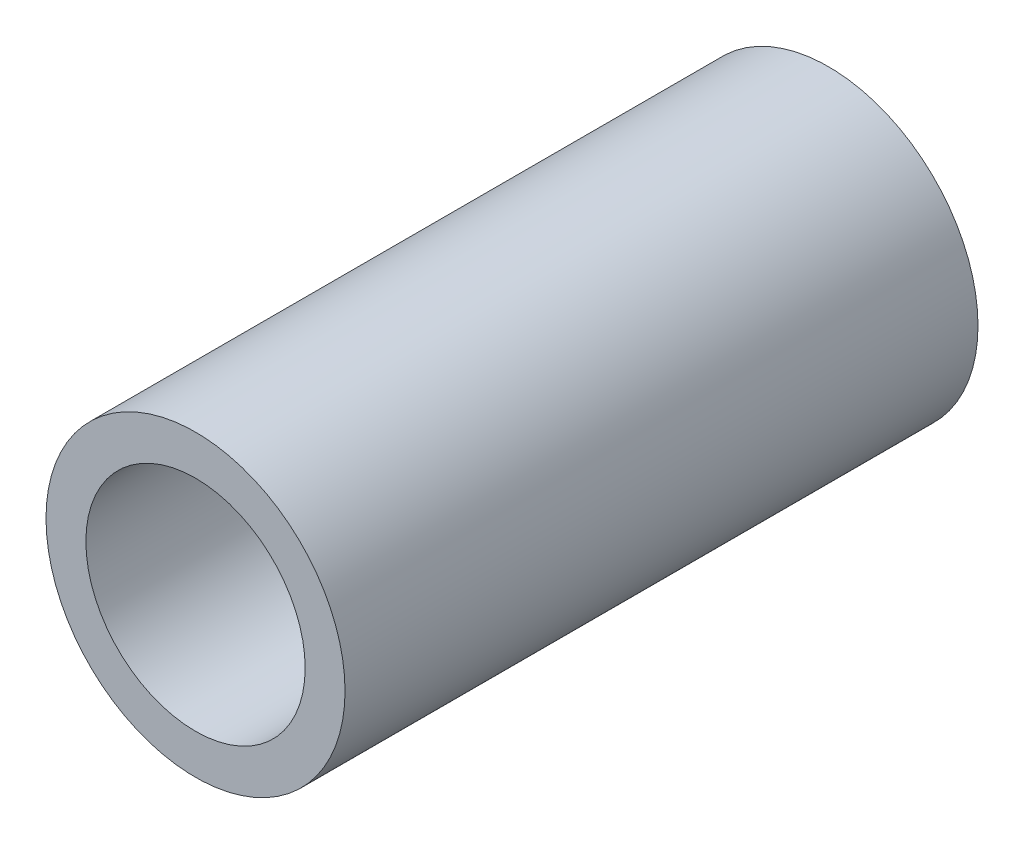
ISO-10303-21;
HEADER;
FILE_DESCRIPTION(('STEP AP214'),'2;1');
FILE_NAME('part.step','',(''),(''),'','','');
FILE_SCHEMA(('AUTOMOTIVE_DESIGN { 1 0 10303 214 1 1 1 1 }'));
ENDSEC;
DATA;
#1=APPLICATION_CONTEXT('core data for automotive mechanical design processes');
#2=APPLICATION_PROTOCOL_DEFINITION('international standard','automotive_design',2000,#1);
#3=PRODUCT_CONTEXT('',#1,'mechanical');
#4=PRODUCT('Part','Part','',(#3));
#5=PRODUCT_RELATED_PRODUCT_CATEGORY('part','',(#4));
#6=PRODUCT_DEFINITION_FORMATION('','',#4);
#7=PRODUCT_DEFINITION_CONTEXT('part definition',#1,'design');
#8=PRODUCT_DEFINITION('design','',#6,#7);
#9=PRODUCT_DEFINITION_SHAPE('','',#8);
#10=(LENGTH_UNIT() NAMED_UNIT(*) SI_UNIT(.MILLI.,.METRE.));
#11=(NAMED_UNIT(*) PLANE_ANGLE_UNIT() SI_UNIT($,.RADIAN.));
#12=(NAMED_UNIT(*) SI_UNIT($,.STERADIAN.) SOLID_ANGLE_UNIT());
#13=UNCERTAINTY_MEASURE_WITH_UNIT(LENGTH_MEASURE(1.E-05),#10,'distance_accuracy_value','');
#14=(GEOMETRIC_REPRESENTATION_CONTEXT(3) GLOBAL_UNCERTAINTY_ASSIGNED_CONTEXT((#13)) GLOBAL_UNIT_ASSIGNED_CONTEXT((#10,
#11,#12)) REPRESENTATION_CONTEXT('',''));
#15=CARTESIAN_POINT('',(0.,0.,0.));
#16=DIRECTION('',(0.,0.,1.));
#17=DIRECTION('',(1.,0.,0.));
#18=AXIS2_PLACEMENT_3D('',#15,#16,#17);
#19=CARTESIAN_POINT('',(0.,0.,6.35));
#20=DIRECTION('',(0.,0.,-1.));
#21=DIRECTION('',(-1.,0.,0.));
#22=AXIS2_PLACEMENT_3D('',#19,#20,#21);
#23=CYLINDRICAL_SURFACE('',#22,1.5);
#24=CARTESIAN_POINT('',(0.,0.,6.35));
#25=DIRECTION('',(0.,0.,1.));
#26=DIRECTION('',(1.,0.,0.));
#27=AXIS2_PLACEMENT_3D('',#24,#25,#26);
#28=CIRCLE('',#27,1.5);
#29=CARTESIAN_POINT('',(1.5,0.,6.35));
#30=VERTEX_POINT('',#29);
#31=EDGE_CURVE('E10',#30,#30,#28,.T.);
#32=ORIENTED_EDGE('',*,*,#31,.F.);
#33=EDGE_LOOP('',(#32));
#34=FACE_BOUND('',#33,.T.);
#35=CARTESIAN_POINT('',(0.,0.,0.));
#36=DIRECTION('',(0.,0.,1.));
#37=DIRECTION('',(1.,0.,0.));
#38=AXIS2_PLACEMENT_3D('',#35,#36,#37);
#39=CIRCLE('',#38,1.5);
#40=CARTESIAN_POINT('',(1.5,0.,0.));
#41=VERTEX_POINT('',#40);
#42=EDGE_CURVE('E36',#41,#41,#39,.T.);
#43=ORIENTED_EDGE('',*,*,#42,.T.);
#44=EDGE_LOOP('',(#43));
#45=FACE_BOUND('',#44,.T.);
#46=ADVANCED_FACE('F33',(#34,#45),#23,.T.);
#47=CARTESIAN_POINT('',(0.,0.,6.35));
#48=DIRECTION('',(0.,0.,1.));
#49=DIRECTION('',(1.,0.,0.));
#50=AXIS2_PLACEMENT_3D('',#47,#48,#49);
#51=PLANE('',#50);
#52=CARTESIAN_POINT('',(0.,0.,6.35));
#53=DIRECTION('',(0.,0.,-1.));
#54=DIRECTION('',(-1.,0.,0.));
#55=AXIS2_PLACEMENT_3D('',#52,#53,#54);
#56=CIRCLE('',#55,1.1);
#57=CARTESIAN_POINT('',(-1.1,0.,6.35));
#58=VERTEX_POINT('',#57);
#59=EDGE_CURVE('E43',#58,#58,#56,.T.);
#60=ORIENTED_EDGE('',*,*,#59,.T.);
#61=EDGE_LOOP('',(#60));
#62=FACE_BOUND('',#61,.T.);
#63=ORIENTED_EDGE('',*,*,#31,.T.);
#64=EDGE_LOOP('',(#63));
#65=FACE_BOUND('',#64,.T.);
#66=ADVANCED_FACE('F51',(#62,#65),#51,.T.);
#67=CARTESIAN_POINT('',(0.,0.,0.));
#68=DIRECTION('',(0.,0.,1.));
#69=DIRECTION('',(1.,0.,0.));
#70=AXIS2_PLACEMENT_3D('',#67,#68,#69);
#71=PLANE('',#70);
#72=CARTESIAN_POINT('',(0.,0.,0.));
#73=DIRECTION('',(0.,0.,-1.));
#74=DIRECTION('',(-1.,0.,0.));
#75=AXIS2_PLACEMENT_3D('',#72,#73,#74);
#76=CIRCLE('',#75,1.1);
#77=CARTESIAN_POINT('',(-1.1,0.,0.));
#78=VERTEX_POINT('',#77);
#79=EDGE_CURVE('E45',#78,#78,#76,.T.);
#80=ORIENTED_EDGE('',*,*,#79,.F.);
#81=EDGE_LOOP('',(#80));
#82=FACE_BOUND('',#81,.T.);
#83=ORIENTED_EDGE('',*,*,#42,.F.);
#84=EDGE_LOOP('',(#83));
#85=FACE_BOUND('',#84,.T.);
#86=ADVANCED_FACE('F56',(#82,#85),#71,.F.);
#87=CARTESIAN_POINT('',(0.,0.,6.35));
#88=DIRECTION('',(0.,0.,-1.));
#89=DIRECTION('',(-1.,0.,0.));
#90=AXIS2_PLACEMENT_3D('',#87,#88,#89);
#91=CYLINDRICAL_SURFACE('',#90,1.1);
#92=ORIENTED_EDGE('',*,*,#59,.F.);
#93=EDGE_LOOP('',(#92));
#94=FACE_BOUND('',#93,.T.);
#95=ORIENTED_EDGE('',*,*,#79,.T.);
#96=EDGE_LOOP('',(#95));
#97=FACE_BOUND('',#96,.T.);
#98=ADVANCED_FACE('F53',(#94,#97),#91,.F.);
#99=CLOSED_SHELL('',(#46,#66,#86,#98));
#100=MANIFOLD_SOLID_BREP('B2',#99);
#101=ADVANCED_BREP_SHAPE_REPRESENTATION('',(#18,#100),#14);
#102=SHAPE_DEFINITION_REPRESENTATION(#9,#101);
ENDSEC;
END-ISO-10303-21;
